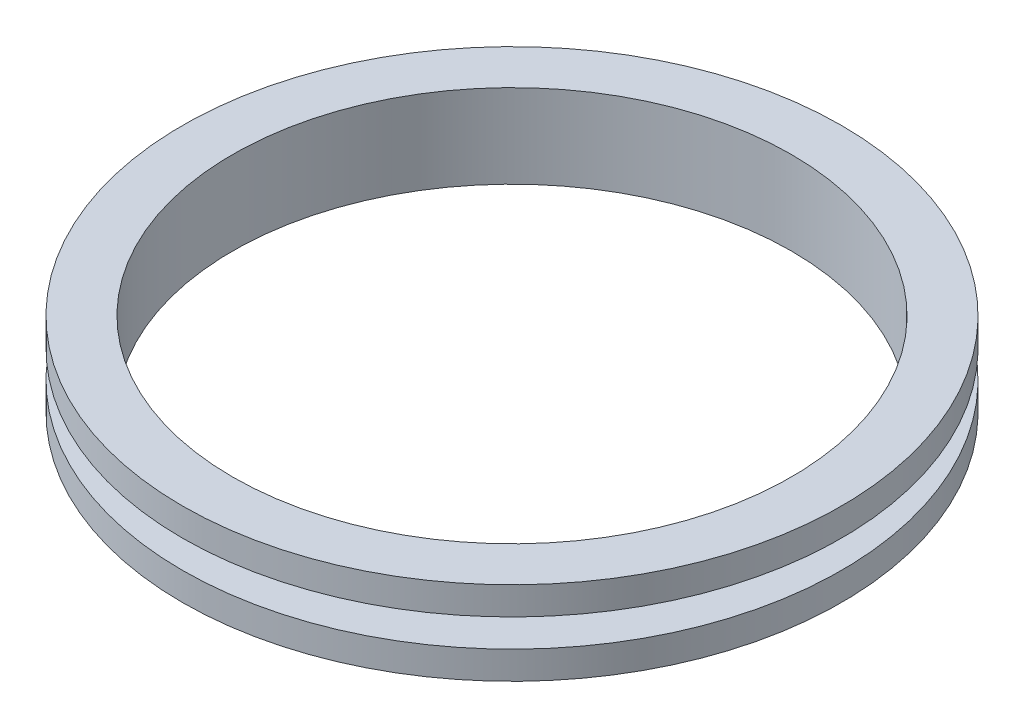
ISO-10303-21;
HEADER;
FILE_DESCRIPTION(('STEP AP214'),'2;1');
FILE_NAME('part.step','',(''),(''),'','','');
FILE_SCHEMA(('AUTOMOTIVE_DESIGN { 1 0 10303 214 1 1 1 1 }'));
ENDSEC;
DATA;
#1=APPLICATION_CONTEXT('core data for automotive mechanical design processes');
#2=APPLICATION_PROTOCOL_DEFINITION('international standard','automotive_design',2000,#1);
#3=PRODUCT_CONTEXT('',#1,'mechanical');
#4=PRODUCT('Part','Part','',(#3));
#5=PRODUCT_RELATED_PRODUCT_CATEGORY('part','',(#4));
#6=PRODUCT_DEFINITION_FORMATION('','',#4);
#7=PRODUCT_DEFINITION_CONTEXT('part definition',#1,'design');
#8=PRODUCT_DEFINITION('design','',#6,#7);
#9=PRODUCT_DEFINITION_SHAPE('','',#8);
#10=(LENGTH_UNIT() NAMED_UNIT(*) SI_UNIT(.MILLI.,.METRE.));
#11=(NAMED_UNIT(*) PLANE_ANGLE_UNIT() SI_UNIT($,.RADIAN.));
#12=(NAMED_UNIT(*) SI_UNIT($,.STERADIAN.) SOLID_ANGLE_UNIT());
#13=UNCERTAINTY_MEASURE_WITH_UNIT(LENGTH_MEASURE(1.E-05),#10,'distance_accuracy_value','');
#14=(GEOMETRIC_REPRESENTATION_CONTEXT(3) GLOBAL_UNCERTAINTY_ASSIGNED_CONTEXT((#13)) GLOBAL_UNIT_ASSIGNED_CONTEXT((#10,
#11,#12)) REPRESENTATION_CONTEXT('',''));
#15=CARTESIAN_POINT('',(0.,0.,0.));
#16=DIRECTION('',(0.,0.,1.));
#17=DIRECTION('',(1.,0.,0.));
#18=AXIS2_PLACEMENT_3D('',#15,#16,#17);
#19=CARTESIAN_POINT('',(0.,2.11666666666667,0.));
#20=DIRECTION('',(0.,-1.,0.));
#21=DIRECTION('',(0.,0.,-1.));
#22=AXIS2_PLACEMENT_3D('',#19,#20,#21);
#23=CYLINDRICAL_SURFACE('',#22,25.019);
#24=CARTESIAN_POINT('',(0.,2.11666666666667,0.));
#25=DIRECTION('',(0.,1.,0.));
#26=DIRECTION('',(0.,0.,1.));
#27=AXIS2_PLACEMENT_3D('',#24,#25,#26);
#28=CIRCLE('',#27,25.019);
#29=CARTESIAN_POINT('',(0.,2.11666666666667,25.019));
#30=VERTEX_POINT('',#29);
#31=EDGE_CURVE('E40',#30,#30,#28,.T.);
#32=ORIENTED_EDGE('',*,*,#31,.F.);
#33=EDGE_LOOP('',(#32));
#34=FACE_BOUND('',#33,.T.);
#35=CARTESIAN_POINT('',(0.,0.,0.));
#36=DIRECTION('',(0.,1.,0.));
#37=DIRECTION('',(0.,0.,1.));
#38=AXIS2_PLACEMENT_3D('',#35,#36,#37);
#39=CIRCLE('',#38,25.019);
#40=CARTESIAN_POINT('',(0.,0.,25.019));
#41=VERTEX_POINT('',#40);
#42=EDGE_CURVE('E36',#41,#41,#39,.T.);
#43=ORIENTED_EDGE('',*,*,#42,.T.);
#44=EDGE_LOOP('',(#43));
#45=FACE_BOUND('',#44,.T.);
#46=ADVANCED_FACE('F33',(#34,#45),#23,.T.);
#47=CARTESIAN_POINT('',(0.,2.11666666666667,0.));
#48=DIRECTION('',(0.,1.,0.));
#49=DIRECTION('',(0.,0.,1.));
#50=AXIS2_PLACEMENT_3D('',#47,#48,#49);
#51=PLANE('',#50);
#52=CARTESIAN_POINT('',(0.,2.11666666666667,0.));
#53=DIRECTION('',(0.,1.,0.));
#54=DIRECTION('',(0.,0.,1.));
#55=AXIS2_PLACEMENT_3D('',#52,#53,#54);
#56=CIRCLE('',#55,21.59);
#57=CARTESIAN_POINT('',(0.,2.11666666666667,21.59));
#58=VERTEX_POINT('',#57);
#59=EDGE_CURVE('E10',#58,#58,#56,.T.);
#60=ORIENTED_EDGE('',*,*,#59,.F.);
#61=EDGE_LOOP('',(#60));
#62=FACE_BOUND('',#61,.T.);
#63=ORIENTED_EDGE('',*,*,#31,.T.);
#64=EDGE_LOOP('',(#63));
#65=FACE_BOUND('',#64,.T.);
#66=ADVANCED_FACE('F91',(#62,#65),#51,.T.);
#67=CARTESIAN_POINT('',(0.,0.,0.));
#68=DIRECTION('',(0.,1.,0.));
#69=DIRECTION('',(0.,0.,1.));
#70=AXIS2_PLACEMENT_3D('',#67,#68,#69);
#71=PLANE('',#70);
#72=CARTESIAN_POINT('',(0.,0.,0.));
#73=DIRECTION('',(0.,1.,0.));
#74=DIRECTION('',(0.,0.,1.));
#75=AXIS2_PLACEMENT_3D('',#72,#73,#74);
#76=CIRCLE('',#75,21.209);
#77=CARTESIAN_POINT('',(0.,0.,21.209));
#78=VERTEX_POINT('',#77);
#79=EDGE_CURVE('E53',#78,#78,#76,.T.);
#80=ORIENTED_EDGE('',*,*,#79,.T.);
#81=EDGE_LOOP('',(#80));
#82=FACE_BOUND('',#81,.T.);
#83=ORIENTED_EDGE('',*,*,#42,.F.);
#84=EDGE_LOOP('',(#83));
#85=FACE_BOUND('',#84,.T.);
#86=ADVANCED_FACE('F62',(#82,#85),#71,.F.);
#87=CARTESIAN_POINT('',(0.,4.23333333333333,0.));
#88=DIRECTION('',(0.,-1.,0.));
#89=DIRECTION('',(0.,0.,-1.));
#90=AXIS2_PLACEMENT_3D('',#87,#88,#89);
#91=CYLINDRICAL_SURFACE('',#90,21.59);
#92=CARTESIAN_POINT('',(0.,4.23333333333333,0.));
#93=DIRECTION('',(0.,1.,0.));
#94=DIRECTION('',(0.,0.,1.));
#95=AXIS2_PLACEMENT_3D('',#92,#93,#94);
#96=CIRCLE('',#95,21.59);
#97=CARTESIAN_POINT('',(0.,4.23333333333333,21.59));
#98=VERTEX_POINT('',#97);
#99=EDGE_CURVE('E46',#98,#98,#96,.T.);
#100=ORIENTED_EDGE('',*,*,#99,.F.);
#101=EDGE_LOOP('',(#100));
#102=FACE_BOUND('',#101,.T.);
#103=ORIENTED_EDGE('',*,*,#59,.T.);
#104=EDGE_LOOP('',(#103));
#105=FACE_BOUND('',#104,.T.);
#106=ADVANCED_FACE('F81',(#102,#105),#91,.T.);
#107=CARTESIAN_POINT('',(0.,6.35,0.));
#108=DIRECTION('',(0.,-1.,0.));
#109=DIRECTION('',(0.,0.,-1.));
#110=AXIS2_PLACEMENT_3D('',#107,#108,#109);
#111=CYLINDRICAL_SURFACE('',#110,25.019);
#112=CARTESIAN_POINT('',(0.,6.35,0.));
#113=DIRECTION('',(0.,1.,0.));
#114=DIRECTION('',(0.,0.,1.));
#115=AXIS2_PLACEMENT_3D('',#112,#113,#114);
#116=CIRCLE('',#115,25.019);
#117=CARTESIAN_POINT('',(0.,6.35,25.019));
#118=VERTEX_POINT('',#117);
#119=EDGE_CURVE('E49',#118,#118,#116,.T.);
#120=ORIENTED_EDGE('',*,*,#119,.F.);
#121=EDGE_LOOP('',(#120));
#122=FACE_BOUND('',#121,.T.);
#123=CARTESIAN_POINT('',(0.,4.23333333333333,0.));
#124=DIRECTION('',(0.,1.,0.));
#125=DIRECTION('',(0.,0.,1.));
#126=AXIS2_PLACEMENT_3D('',#123,#124,#125);
#127=CIRCLE('',#126,25.019);
#128=CARTESIAN_POINT('',(0.,4.23333333333333,25.019));
#129=VERTEX_POINT('',#128);
#130=EDGE_CURVE('E50',#129,#129,#127,.T.);
#131=ORIENTED_EDGE('',*,*,#130,.T.);
#132=EDGE_LOOP('',(#131));
#133=FACE_BOUND('',#132,.T.);
#134=ADVANCED_FACE('F75',(#122,#133),#111,.T.);
#135=CARTESIAN_POINT('',(0.,6.35,0.));
#136=DIRECTION('',(0.,1.,0.));
#137=DIRECTION('',(0.,0.,1.));
#138=AXIS2_PLACEMENT_3D('',#135,#136,#137);
#139=PLANE('',#138);
#140=CARTESIAN_POINT('',(0.,6.35,0.));
#141=DIRECTION('',(0.,1.,0.));
#142=DIRECTION('',(0.,0.,1.));
#143=AXIS2_PLACEMENT_3D('',#140,#141,#142);
#144=CIRCLE('',#143,21.209);
#145=CARTESIAN_POINT('',(0.,6.35,21.209));
#146=VERTEX_POINT('',#145);
#147=EDGE_CURVE('E56',#146,#146,#144,.T.);
#148=ORIENTED_EDGE('',*,*,#147,.F.);
#149=EDGE_LOOP('',(#148));
#150=FACE_BOUND('',#149,.T.);
#151=ORIENTED_EDGE('',*,*,#119,.T.);
#152=EDGE_LOOP('',(#151));
#153=FACE_BOUND('',#152,.T.);
#154=ADVANCED_FACE('F72',(#150,#153),#139,.T.);
#155=CARTESIAN_POINT('',(0.,4.23333333333333,0.));
#156=DIRECTION('',(0.,1.,0.));
#157=DIRECTION('',(0.,0.,1.));
#158=AXIS2_PLACEMENT_3D('',#155,#156,#157);
#159=PLANE('',#158);
#160=ORIENTED_EDGE('',*,*,#99,.T.);
#161=EDGE_LOOP('',(#160));
#162=FACE_BOUND('',#161,.T.);
#163=ORIENTED_EDGE('',*,*,#130,.F.);
#164=EDGE_LOOP('',(#163));
#165=FACE_BOUND('',#164,.T.);
#166=ADVANCED_FACE('F68',(#162,#165),#159,.F.);
#167=CARTESIAN_POINT('',(0.,0.,0.));
#168=DIRECTION('',(0.,1.,0.));
#169=DIRECTION('',(0.,0.,1.));
#170=AXIS2_PLACEMENT_3D('',#167,#168,#169);
#171=CYLINDRICAL_SURFACE('',#170,21.209);
#172=ORIENTED_EDGE('',*,*,#79,.F.);
#173=EDGE_LOOP('',(#172));
#174=FACE_BOUND('',#173,.T.);
#175=ORIENTED_EDGE('',*,*,#147,.T.);
#176=EDGE_LOOP('',(#175));
#177=FACE_BOUND('',#176,.T.);
#178=ADVANCED_FACE('F65',(#174,#177),#171,.F.);
#179=CLOSED_SHELL('',(#46,#66,#86,#106,#134,#154,#166,#178));
#180=MANIFOLD_SOLID_BREP('B2',#179);
#181=ADVANCED_BREP_SHAPE_REPRESENTATION('',(#18,#180),#14);
#182=SHAPE_DEFINITION_REPRESENTATION(#9,#181);
ENDSEC;
END-ISO-10303-21;
